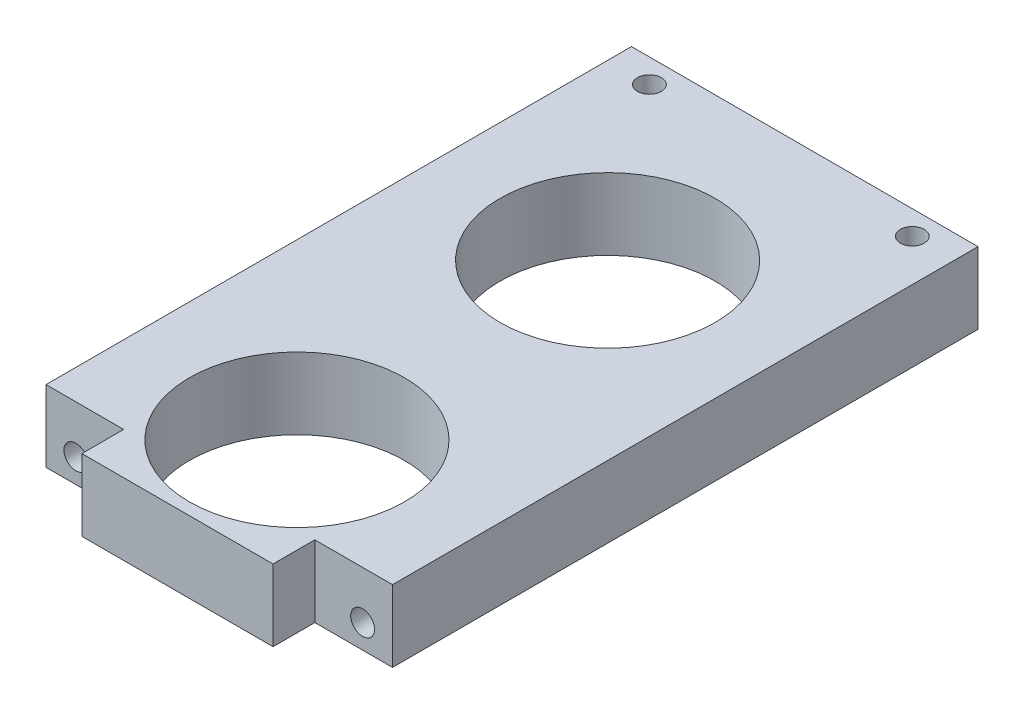
ISO-10303-21;
HEADER;
FILE_DESCRIPTION(('STEP AP214'),'2;1');
FILE_NAME('part.step','',(''),(''),'','','');
FILE_SCHEMA(('AUTOMOTIVE_DESIGN { 1 0 10303 214 1 1 1 1 }'));
ENDSEC;
DATA;
#1=APPLICATION_CONTEXT('core data for automotive mechanical design processes');
#2=APPLICATION_PROTOCOL_DEFINITION('international standard','automotive_design',2000,#1);
#3=PRODUCT_CONTEXT('',#1,'mechanical');
#4=PRODUCT('Part','Part','',(#3));
#5=PRODUCT_RELATED_PRODUCT_CATEGORY('part','',(#4));
#6=PRODUCT_DEFINITION_FORMATION('','',#4);
#7=PRODUCT_DEFINITION_CONTEXT('part definition',#1,'design');
#8=PRODUCT_DEFINITION('design','',#6,#7);
#9=PRODUCT_DEFINITION_SHAPE('','',#8);
#10=(LENGTH_UNIT() NAMED_UNIT(*) SI_UNIT(.MILLI.,.METRE.));
#11=(NAMED_UNIT(*) PLANE_ANGLE_UNIT() SI_UNIT($,.RADIAN.));
#12=(NAMED_UNIT(*) SI_UNIT($,.STERADIAN.) SOLID_ANGLE_UNIT());
#13=UNCERTAINTY_MEASURE_WITH_UNIT(LENGTH_MEASURE(1.E-05),#10,'distance_accuracy_value','');
#14=(GEOMETRIC_REPRESENTATION_CONTEXT(3) GLOBAL_UNCERTAINTY_ASSIGNED_CONTEXT((#13)) GLOBAL_UNIT_ASSIGNED_CONTEXT((#10,
#11,#12)) REPRESENTATION_CONTEXT('',''));
#15=CARTESIAN_POINT('',(0.,0.,0.));
#16=DIRECTION('',(0.,0.,1.));
#17=DIRECTION('',(1.,0.,0.));
#18=AXIS2_PLACEMENT_3D('',#15,#16,#17);
#19=CARTESIAN_POINT('',(0.,6.,0.));
#20=DIRECTION('',(0.,-1.,0.));
#21=DIRECTION('',(0.,0.,-1.));
#22=AXIS2_PLACEMENT_3D('',#19,#20,#21);
#23=PLANE('',#22);
#24=CARTESIAN_POINT('',(-11.,6.,-24.25));
#25=DIRECTION('',(0.,1.,0.));
#26=DIRECTION('',(0.,0.,1.));
#27=AXIS2_PLACEMENT_3D('',#24,#25,#26);
#28=CIRCLE('',#27,1.);
#29=CARTESIAN_POINT('',(-11.,6.,-23.25));
#30=VERTEX_POINT('',#29);
#31=EDGE_CURVE('E146',#30,#30,#28,.T.);
#32=ORIENTED_EDGE('',*,*,#31,.F.);
#33=EDGE_LOOP('',(#32));
#34=FACE_BOUND('',#33,.T.);
#35=CARTESIAN_POINT('',(11.,6.,-24.25));
#36=DIRECTION('',(0.,1.,0.));
#37=DIRECTION('',(0.,0.,1.));
#38=AXIS2_PLACEMENT_3D('',#35,#36,#37);
#39=CIRCLE('',#38,1.);
#40=CARTESIAN_POINT('',(11.,6.,-23.25));
#41=VERTEX_POINT('',#40);
#42=EDGE_CURVE('E152',#41,#41,#39,.T.);
#43=ORIENTED_EDGE('',*,*,#42,.F.);
#44=EDGE_LOOP('',(#43));
#45=FACE_BOUND('',#44,.T.);
#46=DIRECTION('',(0.,0.,1.));
#47=VECTOR('',#46,1.);
#48=CARTESIAN_POINT('',(-14.5,6.,26.25));
#49=LINE('',#48,#47);
#50=CARTESIAN_POINT('',(-14.5,6.,-26.25));
#51=VERTEX_POINT('',#50);
#52=CARTESIAN_POINT('',(-14.5,6.,22.75));
#53=VERTEX_POINT('',#52);
#54=EDGE_CURVE('E122',#51,#53,#49,.T.);
#55=ORIENTED_EDGE('',*,*,#54,.T.);
#56=DIRECTION('',(-1.,0.,0.));
#57=VECTOR('',#56,1.);
#58=CARTESIAN_POINT('',(-14.5,6.,22.75));
#59=LINE('',#58,#57);
#60=CARTESIAN_POINT('',(-8.,6.,22.75));
#61=VERTEX_POINT('',#60);
#62=EDGE_CURVE('E117',#61,#53,#59,.T.);
#63=ORIENTED_EDGE('',*,*,#62,.F.);
#64=DIRECTION('',(0.,0.,-1.));
#65=VECTOR('',#64,1.);
#66=CARTESIAN_POINT('',(-8.,6.,22.75));
#67=LINE('',#66,#65);
#68=CARTESIAN_POINT('',(-8.,6.,26.25));
#69=VERTEX_POINT('',#68);
#70=EDGE_CURVE('E106',#69,#61,#67,.T.);
#71=ORIENTED_EDGE('',*,*,#70,.F.);
#72=DIRECTION('',(1.,0.,0.));
#73=VECTOR('',#72,1.);
#74=CARTESIAN_POINT('',(-14.5,6.,26.25));
#75=LINE('',#74,#73);
#76=CARTESIAN_POINT('',(7.99999999999999,6.,26.25));
#77=VERTEX_POINT('',#76);
#78=EDGE_CURVE('E116',#69,#77,#75,.T.);
#79=ORIENTED_EDGE('',*,*,#78,.T.);
#80=DIRECTION('',(0.,0.,1.));
#81=VECTOR('',#80,1.);
#82=CARTESIAN_POINT('',(8.,6.,22.75));
#83=LINE('',#82,#81);
#84=CARTESIAN_POINT('',(8.,6.,22.75));
#85=VERTEX_POINT('',#84);
#86=EDGE_CURVE('E56',#85,#77,#83,.T.);
#87=ORIENTED_EDGE('',*,*,#86,.F.);
#88=DIRECTION('',(-1.,0.,0.));
#89=VECTOR('',#88,1.);
#90=CARTESIAN_POINT('',(14.5,6.,22.75));
#91=LINE('',#90,#89);
#92=CARTESIAN_POINT('',(14.5,6.,22.75));
#93=VERTEX_POINT('',#92);
#94=EDGE_CURVE('E162',#93,#85,#91,.T.);
#95=ORIENTED_EDGE('',*,*,#94,.F.);
#96=DIRECTION('',(0.,0.,-1.));
#97=VECTOR('',#96,1.);
#98=CARTESIAN_POINT('',(14.5,6.,26.25));
#99=LINE('',#98,#97);
#100=CARTESIAN_POINT('',(14.5,6.,-26.25));
#101=VERTEX_POINT('',#100);
#102=EDGE_CURVE('E140',#93,#101,#99,.T.);
#103=ORIENTED_EDGE('',*,*,#102,.T.);
#104=DIRECTION('',(-1.,0.,0.));
#105=VECTOR('',#104,1.);
#106=CARTESIAN_POINT('',(-14.5,6.,-26.25));
#107=LINE('',#106,#105);
#108=EDGE_CURVE('E127',#101,#51,#107,.T.);
#109=ORIENTED_EDGE('',*,*,#108,.T.);
#110=EDGE_LOOP('',(#55,#63,#71,#79,#87,#95,#103,#109));
#111=FACE_BOUND('',#110,.T.);
#112=CARTESIAN_POINT('',(0.,6.,16.25));
#113=DIRECTION('',(0.,1.,0.));
#114=DIRECTION('',(0.,0.,1.));
#115=AXIS2_PLACEMENT_3D('',#112,#113,#114);
#116=CIRCLE('',#115,9.);
#117=CARTESIAN_POINT('',(0.,6.,25.25));
#118=VERTEX_POINT('',#117);
#119=EDGE_CURVE('E134',#118,#118,#116,.T.);
#120=ORIENTED_EDGE('',*,*,#119,.F.);
#121=EDGE_LOOP('',(#120));
#122=FACE_BOUND('',#121,.T.);
#123=CARTESIAN_POINT('',(0.,6.,-9.75));
#124=DIRECTION('',(0.,1.,0.));
#125=DIRECTION('',(0.,0.,1.));
#126=AXIS2_PLACEMENT_3D('',#123,#124,#125);
#127=CIRCLE('',#126,9.);
#128=CARTESIAN_POINT('',(0.,6.,-0.750000000000002));
#129=VERTEX_POINT('',#128);
#130=EDGE_CURVE('E191',#129,#129,#127,.T.);
#131=ORIENTED_EDGE('',*,*,#130,.F.);
#132=EDGE_LOOP('',(#131));
#133=FACE_BOUND('',#132,.T.);
#134=ADVANCED_FACE('F39',(#34,#45,#111,#122,#133),#23,.F.);
#135=CARTESIAN_POINT('',(0.,0.,0.));
#136=DIRECTION('',(0.,-1.,0.));
#137=DIRECTION('',(0.,0.,-1.));
#138=AXIS2_PLACEMENT_3D('',#135,#136,#137);
#139=PLANE('',#138);
#140=CARTESIAN_POINT('',(-11.,0.,-24.25));
#141=DIRECTION('',(0.,-1.,0.));
#142=DIRECTION('',(0.,0.,-1.));
#143=AXIS2_PLACEMENT_3D('',#140,#141,#142);
#144=CIRCLE('',#143,1.);
#145=CARTESIAN_POINT('',(-11.,0.,-25.25));
#146=VERTEX_POINT('',#145);
#147=EDGE_CURVE('E43',#146,#146,#144,.T.);
#148=ORIENTED_EDGE('',*,*,#147,.F.);
#149=EDGE_LOOP('',(#148));
#150=FACE_BOUND('',#149,.T.);
#151=CARTESIAN_POINT('',(11.,0.,-24.25));
#152=DIRECTION('',(0.,-1.,0.));
#153=DIRECTION('',(0.,0.,-1.));
#154=AXIS2_PLACEMENT_3D('',#151,#152,#153);
#155=CIRCLE('',#154,1.);
#156=CARTESIAN_POINT('',(11.,0.,-25.25));
#157=VERTEX_POINT('',#156);
#158=EDGE_CURVE('E144',#157,#157,#155,.T.);
#159=ORIENTED_EDGE('',*,*,#158,.F.);
#160=EDGE_LOOP('',(#159));
#161=FACE_BOUND('',#160,.T.);
#162=DIRECTION('',(1.,0.,0.));
#163=VECTOR('',#162,1.);
#164=CARTESIAN_POINT('',(0.,0.,22.75));
#165=LINE('',#164,#163);
#166=CARTESIAN_POINT('',(-14.5,0.,22.75));
#167=VERTEX_POINT('',#166);
#168=CARTESIAN_POINT('',(-8.,0.,22.75));
#169=VERTEX_POINT('',#168);
#170=EDGE_CURVE('E186',#167,#169,#165,.T.);
#171=ORIENTED_EDGE('',*,*,#170,.F.);
#172=DIRECTION('',(0.,0.,1.));
#173=VECTOR('',#172,1.);
#174=CARTESIAN_POINT('',(-14.5,0.,26.25));
#175=LINE('',#174,#173);
#176=CARTESIAN_POINT('',(-14.5,0.,-26.25));
#177=VERTEX_POINT('',#176);
#178=EDGE_CURVE('E136',#177,#167,#175,.T.);
#179=ORIENTED_EDGE('',*,*,#178,.F.);
#180=DIRECTION('',(-1.,0.,0.));
#181=VECTOR('',#180,1.);
#182=CARTESIAN_POINT('',(-14.5,0.,-26.25));
#183=LINE('',#182,#181);
#184=CARTESIAN_POINT('',(14.5,0.,-26.25));
#185=VERTEX_POINT('',#184);
#186=EDGE_CURVE('E133',#185,#177,#183,.T.);
#187=ORIENTED_EDGE('',*,*,#186,.F.);
#188=DIRECTION('',(0.,0.,-1.));
#189=VECTOR('',#188,1.);
#190=CARTESIAN_POINT('',(14.5,0.,26.25));
#191=LINE('',#190,#189);
#192=CARTESIAN_POINT('',(14.5,0.,22.75));
#193=VERTEX_POINT('',#192);
#194=EDGE_CURVE('E131',#193,#185,#191,.T.);
#195=ORIENTED_EDGE('',*,*,#194,.F.);
#196=DIRECTION('',(1.,0.,0.));
#197=VECTOR('',#196,1.);
#198=CARTESIAN_POINT('',(0.,0.,22.75));
#199=LINE('',#198,#197);
#200=CARTESIAN_POINT('',(8.,0.,22.75));
#201=VERTEX_POINT('',#200);
#202=EDGE_CURVE('E188',#201,#193,#199,.T.);
#203=ORIENTED_EDGE('',*,*,#202,.F.);
#204=DIRECTION('',(0.,0.,-1.));
#205=VECTOR('',#204,1.);
#206=CARTESIAN_POINT('',(8.,0.,0.));
#207=LINE('',#206,#205);
#208=CARTESIAN_POINT('',(8.,0.,26.25));
#209=VERTEX_POINT('',#208);
#210=EDGE_CURVE('E176',#209,#201,#207,.T.);
#211=ORIENTED_EDGE('',*,*,#210,.F.);
#212=DIRECTION('',(1.,0.,0.));
#213=VECTOR('',#212,1.);
#214=CARTESIAN_POINT('',(-14.5,0.,26.25));
#215=LINE('',#214,#213);
#216=CARTESIAN_POINT('',(-8.,0.,26.25));
#217=VERTEX_POINT('',#216);
#218=EDGE_CURVE('E139',#217,#209,#215,.T.);
#219=ORIENTED_EDGE('',*,*,#218,.F.);
#220=DIRECTION('',(0.,0.,1.));
#221=VECTOR('',#220,1.);
#222=CARTESIAN_POINT('',(-8.,0.,0.));
#223=LINE('',#222,#221);
#224=EDGE_CURVE('E64',#169,#217,#223,.T.);
#225=ORIENTED_EDGE('',*,*,#224,.F.);
#226=EDGE_LOOP('',(#171,#179,#187,#195,#203,#211,#219,#225));
#227=FACE_BOUND('',#226,.T.);
#228=CARTESIAN_POINT('',(0.,0.,16.25));
#229=DIRECTION('',(0.,1.,0.));
#230=DIRECTION('',(0.,0.,1.));
#231=AXIS2_PLACEMENT_3D('',#228,#229,#230);
#232=CIRCLE('',#231,9.);
#233=CARTESIAN_POINT('',(0.,0.,25.25));
#234=VERTEX_POINT('',#233);
#235=EDGE_CURVE('E194',#234,#234,#232,.T.);
#236=ORIENTED_EDGE('',*,*,#235,.T.);
#237=EDGE_LOOP('',(#236));
#238=FACE_BOUND('',#237,.T.);
#239=CARTESIAN_POINT('',(0.,0.,-9.75));
#240=DIRECTION('',(0.,1.,0.));
#241=DIRECTION('',(0.,0.,1.));
#242=AXIS2_PLACEMENT_3D('',#239,#240,#241);
#243=CIRCLE('',#242,9.);
#244=CARTESIAN_POINT('',(0.,0.,-0.750000000000002));
#245=VERTEX_POINT('',#244);
#246=EDGE_CURVE('E190',#245,#245,#243,.T.);
#247=ORIENTED_EDGE('',*,*,#246,.T.);
#248=EDGE_LOOP('',(#247));
#249=FACE_BOUND('',#248,.T.);
#250=ADVANCED_FACE('F217',(#150,#161,#227,#238,#249),#139,.T.);
#251=CARTESIAN_POINT('',(14.5,6.,26.25));
#252=DIRECTION('',(-1.,0.,0.));
#253=DIRECTION('',(0.,0.,1.));
#254=AXIS2_PLACEMENT_3D('',#251,#252,#253);
#255=PLANE('',#254);
#256=ORIENTED_EDGE('',*,*,#102,.F.);
#257=DIRECTION('',(0.,1.,0.));
#258=VECTOR('',#257,1.);
#259=CARTESIAN_POINT('',(14.5,-4.,22.75));
#260=LINE('',#259,#258);
#261=EDGE_CURVE('E181',#193,#93,#260,.T.);
#262=ORIENTED_EDGE('',*,*,#261,.F.);
#263=ORIENTED_EDGE('',*,*,#194,.T.);
#264=DIRECTION('',(0.,-1.,0.));
#265=VECTOR('',#264,1.);
#266=CARTESIAN_POINT('',(14.5,6.,-26.25));
#267=LINE('',#266,#265);
#268=EDGE_CURVE('E125',#101,#185,#267,.T.);
#269=ORIENTED_EDGE('',*,*,#268,.F.);
#270=EDGE_LOOP('',(#256,#262,#263,#269));
#271=FACE_BOUND('',#270,.T.);
#272=ADVANCED_FACE('F41',(#271),#255,.F.);
#273=CARTESIAN_POINT('',(-14.5,6.,-26.25));
#274=DIRECTION('',(0.,0.,1.));
#275=DIRECTION('',(1.,0.,0.));
#276=AXIS2_PLACEMENT_3D('',#273,#274,#275);
#277=PLANE('',#276);
#278=ORIENTED_EDGE('',*,*,#186,.T.);
#279=DIRECTION('',(0.,-1.,0.));
#280=VECTOR('',#279,1.);
#281=CARTESIAN_POINT('',(-14.5,6.,-26.25));
#282=LINE('',#281,#280);
#283=EDGE_CURVE('E121',#51,#177,#282,.T.);
#284=ORIENTED_EDGE('',*,*,#283,.F.);
#285=ORIENTED_EDGE('',*,*,#108,.F.);
#286=ORIENTED_EDGE('',*,*,#268,.T.);
#287=EDGE_LOOP('',(#278,#284,#285,#286));
#288=FACE_BOUND('',#287,.T.);
#289=ADVANCED_FACE('F208',(#288),#277,.F.);
#290=CARTESIAN_POINT('',(-14.5,6.,26.25));
#291=DIRECTION('',(1.,0.,0.));
#292=DIRECTION('',(0.,0.,-1.));
#293=AXIS2_PLACEMENT_3D('',#290,#291,#292);
#294=PLANE('',#293);
#295=ORIENTED_EDGE('',*,*,#178,.T.);
#296=DIRECTION('',(0.,1.,0.));
#297=VECTOR('',#296,1.);
#298=CARTESIAN_POINT('',(-14.5,-4.,22.75));
#299=LINE('',#298,#297);
#300=EDGE_CURVE('E173',#167,#53,#299,.T.);
#301=ORIENTED_EDGE('',*,*,#300,.T.);
#302=ORIENTED_EDGE('',*,*,#54,.F.);
#303=ORIENTED_EDGE('',*,*,#283,.T.);
#304=EDGE_LOOP('',(#295,#301,#302,#303));
#305=FACE_BOUND('',#304,.T.);
#306=ADVANCED_FACE('F212',(#305),#294,.F.);
#307=CARTESIAN_POINT('',(-14.5,6.,26.25));
#308=DIRECTION('',(0.,0.,-1.));
#309=DIRECTION('',(-1.,0.,0.));
#310=AXIS2_PLACEMENT_3D('',#307,#308,#309);
#311=PLANE('',#310);
#312=ORIENTED_EDGE('',*,*,#78,.F.);
#313=DIRECTION('',(0.,-1.,0.));
#314=VECTOR('',#313,1.);
#315=CARTESIAN_POINT('',(-8.,6.,26.25));
#316=LINE('',#315,#314);
#317=EDGE_CURVE('E11',#69,#217,#316,.T.);
#318=ORIENTED_EDGE('',*,*,#317,.T.);
#319=ORIENTED_EDGE('',*,*,#218,.T.);
#320=DIRECTION('',(0.,1.,0.));
#321=VECTOR('',#320,1.);
#322=CARTESIAN_POINT('',(8.,6.,26.25));
#323=LINE('',#322,#321);
#324=EDGE_CURVE('E48',#209,#77,#323,.T.);
#325=ORIENTED_EDGE('',*,*,#324,.T.);
#326=EDGE_LOOP('',(#312,#318,#319,#325));
#327=FACE_BOUND('',#326,.T.);
#328=ADVANCED_FACE('F120',(#327),#311,.F.);
#329=CARTESIAN_POINT('',(0.,6.,16.25));
#330=DIRECTION('',(0.,-1.,0.));
#331=DIRECTION('',(0.,0.,-1.));
#332=AXIS2_PLACEMENT_3D('',#329,#330,#331);
#333=CYLINDRICAL_SURFACE('',#332,9.);
#334=ORIENTED_EDGE('',*,*,#119,.T.);
#335=EDGE_LOOP('',(#334));
#336=FACE_BOUND('',#335,.T.);
#337=ORIENTED_EDGE('',*,*,#235,.F.);
#338=EDGE_LOOP('',(#337));
#339=FACE_BOUND('',#338,.T.);
#340=ADVANCED_FACE('F242',(#336,#339),#333,.F.);
#341=CARTESIAN_POINT('',(0.,6.,-9.75));
#342=DIRECTION('',(0.,-1.,0.));
#343=DIRECTION('',(0.,0.,-1.));
#344=AXIS2_PLACEMENT_3D('',#341,#342,#343);
#345=CYLINDRICAL_SURFACE('',#344,9.);
#346=ORIENTED_EDGE('',*,*,#130,.T.);
#347=EDGE_LOOP('',(#346));
#348=FACE_BOUND('',#347,.T.);
#349=ORIENTED_EDGE('',*,*,#246,.F.);
#350=EDGE_LOOP('',(#349));
#351=FACE_BOUND('',#350,.T.);
#352=ADVANCED_FACE('F263',(#348,#351),#345,.F.);
#353=CARTESIAN_POINT('',(8.,-4.,22.75));
#354=DIRECTION('',(-1.,0.,0.));
#355=DIRECTION('',(0.,0.,1.));
#356=AXIS2_PLACEMENT_3D('',#353,#354,#355);
#357=PLANE('',#356);
#358=ORIENTED_EDGE('',*,*,#210,.T.);
#359=DIRECTION('',(0.,1.,0.));
#360=VECTOR('',#359,1.);
#361=CARTESIAN_POINT('',(8.,-4.,22.75));
#362=LINE('',#361,#360);
#363=EDGE_CURVE('E118',#201,#85,#362,.T.);
#364=ORIENTED_EDGE('',*,*,#363,.T.);
#365=ORIENTED_EDGE('',*,*,#86,.T.);
#366=ORIENTED_EDGE('',*,*,#324,.F.);
#367=EDGE_LOOP('',(#358,#364,#365,#366));
#368=FACE_BOUND('',#367,.T.);
#369=ADVANCED_FACE('F223',(#368),#357,.F.);
#370=CARTESIAN_POINT('',(14.5,-4.,22.75));
#371=DIRECTION('',(0.,0.,-1.));
#372=DIRECTION('',(-1.,0.,0.));
#373=AXIS2_PLACEMENT_3D('',#370,#371,#372);
#374=PLANE('',#373);
#375=CARTESIAN_POINT('',(12.,2.,22.75));
#376=DIRECTION('',(0.,0.,1.));
#377=DIRECTION('',(1.,0.,0.));
#378=AXIS2_PLACEMENT_3D('',#375,#376,#377);
#379=CIRCLE('',#378,1.);
#380=CARTESIAN_POINT('',(13.,2.,22.75));
#381=VERTEX_POINT('',#380);
#382=EDGE_CURVE('E150',#381,#381,#379,.T.);
#383=ORIENTED_EDGE('',*,*,#382,.F.);
#384=EDGE_LOOP('',(#383));
#385=FACE_BOUND('',#384,.T.);
#386=ORIENTED_EDGE('',*,*,#202,.T.);
#387=ORIENTED_EDGE('',*,*,#261,.T.);
#388=ORIENTED_EDGE('',*,*,#94,.T.);
#389=ORIENTED_EDGE('',*,*,#363,.F.);
#390=EDGE_LOOP('',(#386,#387,#388,#389));
#391=FACE_BOUND('',#390,.T.);
#392=ADVANCED_FACE('F225',(#385,#391),#374,.F.);
#393=CARTESIAN_POINT('',(-14.5,-4.,22.75));
#394=DIRECTION('',(0.,0.,-1.));
#395=DIRECTION('',(-1.,0.,0.));
#396=AXIS2_PLACEMENT_3D('',#393,#394,#395);
#397=PLANE('',#396);
#398=CARTESIAN_POINT('',(-12.,2.,22.75));
#399=DIRECTION('',(0.,0.,1.));
#400=DIRECTION('',(1.,0.,0.));
#401=AXIS2_PLACEMENT_3D('',#398,#399,#400);
#402=CIRCLE('',#401,1.);
#403=CARTESIAN_POINT('',(-11.,2.,22.75));
#404=VERTEX_POINT('',#403);
#405=EDGE_CURVE('E163',#404,#404,#402,.T.);
#406=ORIENTED_EDGE('',*,*,#405,.F.);
#407=EDGE_LOOP('',(#406));
#408=FACE_BOUND('',#407,.T.);
#409=ORIENTED_EDGE('',*,*,#170,.T.);
#410=DIRECTION('',(0.,1.,0.));
#411=VECTOR('',#410,1.);
#412=CARTESIAN_POINT('',(-8.,-4.,22.75));
#413=LINE('',#412,#411);
#414=EDGE_CURVE('E172',#169,#61,#413,.T.);
#415=ORIENTED_EDGE('',*,*,#414,.T.);
#416=ORIENTED_EDGE('',*,*,#62,.T.);
#417=ORIENTED_EDGE('',*,*,#300,.F.);
#418=EDGE_LOOP('',(#409,#415,#416,#417));
#419=FACE_BOUND('',#418,.T.);
#420=ADVANCED_FACE('F215',(#408,#419),#397,.F.);
#421=CARTESIAN_POINT('',(-8.,-4.,22.75));
#422=DIRECTION('',(1.,0.,0.));
#423=DIRECTION('',(0.,0.,-1.));
#424=AXIS2_PLACEMENT_3D('',#421,#422,#423);
#425=PLANE('',#424);
#426=ORIENTED_EDGE('',*,*,#224,.T.);
#427=ORIENTED_EDGE('',*,*,#317,.F.);
#428=ORIENTED_EDGE('',*,*,#70,.T.);
#429=ORIENTED_EDGE('',*,*,#414,.F.);
#430=EDGE_LOOP('',(#426,#427,#428,#429));
#431=FACE_BOUND('',#430,.T.);
#432=ADVANCED_FACE('F105',(#431),#425,.F.);
#433=CARTESIAN_POINT('',(-12.,2.,14.75));
#434=DIRECTION('',(0.,0.,1.));
#435=DIRECTION('',(1.,0.,0.));
#436=AXIS2_PLACEMENT_3D('',#433,#434,#435);
#437=CYLINDRICAL_SURFACE('',#436,1.);
#438=CARTESIAN_POINT('',(-12.,2.,14.75));
#439=DIRECTION('',(0.,0.,1.));
#440=DIRECTION('',(1.,0.,0.));
#441=AXIS2_PLACEMENT_3D('',#438,#439,#440);
#442=CIRCLE('',#441,1.);
#443=CARTESIAN_POINT('',(-11.,2.,14.75));
#444=VERTEX_POINT('',#443);
#445=EDGE_CURVE('E159',#444,#444,#442,.T.);
#446=ORIENTED_EDGE('',*,*,#445,.F.);
#447=EDGE_LOOP('',(#446));
#448=FACE_BOUND('',#447,.T.);
#449=ORIENTED_EDGE('',*,*,#405,.T.);
#450=EDGE_LOOP('',(#449));
#451=FACE_BOUND('',#450,.T.);
#452=ADVANCED_FACE('F296',(#448,#451),#437,.F.);
#453=CARTESIAN_POINT('',(-12.,2.,14.75));
#454=DIRECTION('',(0.,0.,1.));
#455=DIRECTION('',(1.,0.,0.));
#456=AXIS2_PLACEMENT_3D('',#453,#454,#455);
#457=PLANE('',#456);
#458=ORIENTED_EDGE('',*,*,#445,.T.);
#459=EDGE_LOOP('',(#458));
#460=FACE_BOUND('',#459,.T.);
#461=ADVANCED_FACE('F303',(#460),#457,.T.);
#462=CARTESIAN_POINT('',(12.,2.,14.75));
#463=DIRECTION('',(0.,0.,1.));
#464=DIRECTION('',(1.,0.,0.));
#465=AXIS2_PLACEMENT_3D('',#462,#463,#464);
#466=CYLINDRICAL_SURFACE('',#465,1.);
#467=CARTESIAN_POINT('',(12.,2.,14.75));
#468=DIRECTION('',(0.,0.,1.));
#469=DIRECTION('',(1.,0.,0.));
#470=AXIS2_PLACEMENT_3D('',#467,#468,#469);
#471=CIRCLE('',#470,1.);
#472=CARTESIAN_POINT('',(13.,2.,14.75));
#473=VERTEX_POINT('',#472);
#474=EDGE_CURVE('E166',#473,#473,#471,.T.);
#475=ORIENTED_EDGE('',*,*,#474,.F.);
#476=EDGE_LOOP('',(#475));
#477=FACE_BOUND('',#476,.T.);
#478=ORIENTED_EDGE('',*,*,#382,.T.);
#479=EDGE_LOOP('',(#478));
#480=FACE_BOUND('',#479,.T.);
#481=ADVANCED_FACE('F312',(#477,#480),#466,.F.);
#482=CARTESIAN_POINT('',(12.,2.,14.75));
#483=DIRECTION('',(0.,0.,1.));
#484=DIRECTION('',(1.,0.,0.));
#485=AXIS2_PLACEMENT_3D('',#482,#483,#484);
#486=PLANE('',#485);
#487=ORIENTED_EDGE('',*,*,#474,.T.);
#488=EDGE_LOOP('',(#487));
#489=FACE_BOUND('',#488,.T.);
#490=ADVANCED_FACE('F321',(#489),#486,.T.);
#491=CARTESIAN_POINT('',(11.,-4.,-24.25));
#492=DIRECTION('',(0.,1.,0.));
#493=DIRECTION('',(0.,0.,1.));
#494=AXIS2_PLACEMENT_3D('',#491,#492,#493);
#495=CYLINDRICAL_SURFACE('',#494,1.);
#496=ORIENTED_EDGE('',*,*,#158,.T.);
#497=EDGE_LOOP('',(#496));
#498=FACE_BOUND('',#497,.T.);
#499=ORIENTED_EDGE('',*,*,#42,.T.);
#500=EDGE_LOOP('',(#499));
#501=FACE_BOUND('',#500,.T.);
#502=ADVANCED_FACE('F330',(#498,#501),#495,.F.);
#503=CARTESIAN_POINT('',(-11.,-4.,-24.25));
#504=DIRECTION('',(0.,1.,0.));
#505=DIRECTION('',(0.,0.,1.));
#506=AXIS2_PLACEMENT_3D('',#503,#504,#505);
#507=CYLINDRICAL_SURFACE('',#506,1.);
#508=ORIENTED_EDGE('',*,*,#147,.T.);
#509=EDGE_LOOP('',(#508));
#510=FACE_BOUND('',#509,.T.);
#511=ORIENTED_EDGE('',*,*,#31,.T.);
#512=EDGE_LOOP('',(#511));
#513=FACE_BOUND('',#512,.T.);
#514=ADVANCED_FACE('F337',(#510,#513),#507,.F.);
#515=CLOSED_SHELL('',(#134,#250,#272,#289,#306,#328,#340,#352,#369,#392,#420,#432,#452,#461,
#481,#490,#502,#514));
#516=MANIFOLD_SOLID_BREP('B2',#515);
#517=ADVANCED_BREP_SHAPE_REPRESENTATION('',(#18,#516),#14);
#518=SHAPE_DEFINITION_REPRESENTATION(#9,#517);
ENDSEC;
END-ISO-10303-21;
